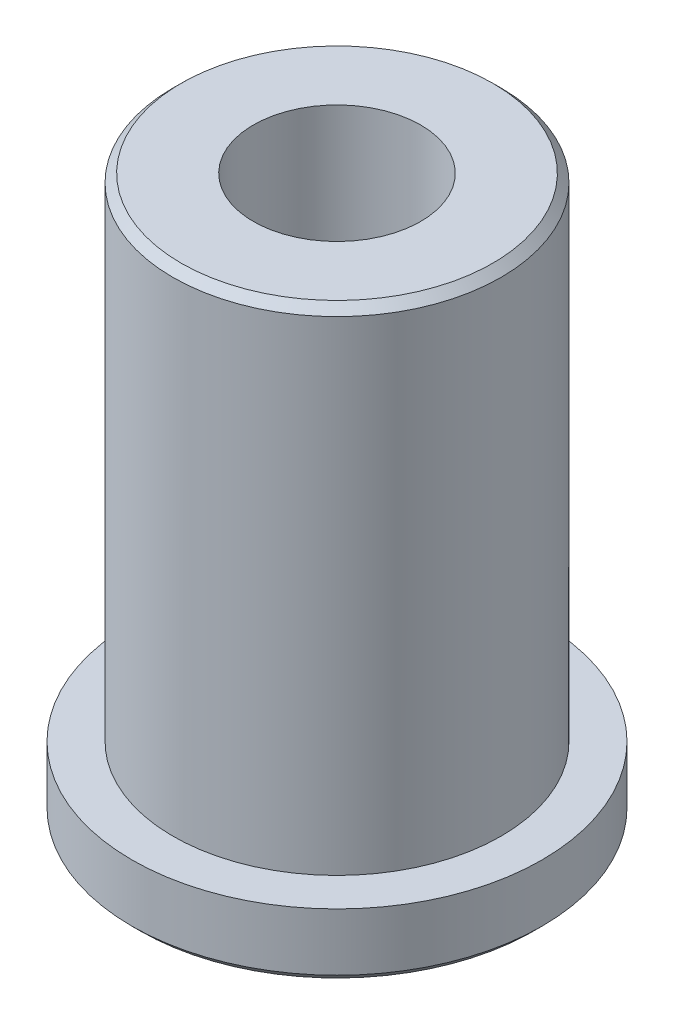
ISO-10303-21;
HEADER;
FILE_DESCRIPTION(('STEP AP214'),'2;1');
FILE_NAME('part.step','',(''),(''),'','','');
FILE_SCHEMA(('AUTOMOTIVE_DESIGN { 1 0 10303 214 1 1 1 1 }'));
ENDSEC;
DATA;
#1=APPLICATION_CONTEXT('core data for automotive mechanical design processes');
#2=APPLICATION_PROTOCOL_DEFINITION('international standard','automotive_design',2000,#1);
#3=PRODUCT_CONTEXT('',#1,'mechanical');
#4=PRODUCT('Part','Part','',(#3));
#5=PRODUCT_RELATED_PRODUCT_CATEGORY('part','',(#4));
#6=PRODUCT_DEFINITION_FORMATION('','',#4);
#7=PRODUCT_DEFINITION_CONTEXT('part definition',#1,'design');
#8=PRODUCT_DEFINITION('design','',#6,#7);
#9=PRODUCT_DEFINITION_SHAPE('','',#8);
#10=(LENGTH_UNIT() NAMED_UNIT(*) SI_UNIT(.MILLI.,.METRE.));
#11=(NAMED_UNIT(*) PLANE_ANGLE_UNIT() SI_UNIT($,.RADIAN.));
#12=(NAMED_UNIT(*) SI_UNIT($,.STERADIAN.) SOLID_ANGLE_UNIT());
#13=UNCERTAINTY_MEASURE_WITH_UNIT(LENGTH_MEASURE(1.E-05),#10,'distance_accuracy_value','');
#14=(GEOMETRIC_REPRESENTATION_CONTEXT(3) GLOBAL_UNCERTAINTY_ASSIGNED_CONTEXT((#13)) GLOBAL_UNIT_ASSIGNED_CONTEXT((#10,
#11,#12)) REPRESENTATION_CONTEXT('',''));
#15=CARTESIAN_POINT('',(0.,0.,0.));
#16=DIRECTION('',(0.,0.,1.));
#17=DIRECTION('',(1.,0.,0.));
#18=AXIS2_PLACEMENT_3D('',#15,#16,#17);
#19=CARTESIAN_POINT('',(0.,5.6843418860808E-11,0.));
#20=DIRECTION('',(0.,-1.,0.));
#21=DIRECTION('',(0.,0.,-1.));
#22=AXIS2_PLACEMENT_3D('',#19,#20,#21);
#23=CONICAL_SURFACE('',#22,6.50000000001683,0.785398163397448);
#24=CARTESIAN_POINT('',(0.,1.4,0.));
#25=DIRECTION('',(0.,-1.,0.));
#26=DIRECTION('',(0.,0.,-1.));
#27=AXIS2_PLACEMENT_3D('',#24,#25,#26);
#28=CIRCLE('',#27,5.1);
#29=CARTESIAN_POINT('',(0.,1.4,-5.1));
#30=VERTEX_POINT('',#29);
#31=EDGE_CURVE('E30',#30,#30,#28,.F.);
#32=ORIENTED_EDGE('',*,*,#31,.T.);
#33=EDGE_LOOP('',(#32));
#34=FACE_BOUND('',#33,.T.);
#35=CARTESIAN_POINT('',(0.,5.6843418860808E-11,0.));
#36=DIRECTION('',(0.,-1.,0.));
#37=DIRECTION('',(0.,0.,-1.));
#38=AXIS2_PLACEMENT_3D('',#35,#36,#37);
#39=CIRCLE('',#38,6.50000000001683);
#40=CARTESIAN_POINT('',(0.,5.6843418860808E-11,-6.50000000001683));
#41=VERTEX_POINT('',#40);
#42=EDGE_CURVE('E17',#41,#41,#39,.T.);
#43=ORIENTED_EDGE('',*,*,#42,.T.);
#44=EDGE_LOOP('',(#43));
#45=FACE_BOUND('',#44,.T.);
#46=ADVANCED_FACE('F14',(#34,#45),#23,.F.);
#47=CARTESIAN_POINT('',(-12.5,0.,0.));
#48=DIRECTION('',(0.,1.,0.));
#49=DIRECTION('',(-1.,0.,0.));
#50=AXIS2_PLACEMENT_3D('',#47,#48,#49);
#51=PLANE('',#50);
#52=CARTESIAN_POINT('',(0.,0.,0.));
#53=DIRECTION('',(0.,1.,0.));
#54=DIRECTION('',(0.,0.,1.));
#55=AXIS2_PLACEMENT_3D('',#52,#53,#54);
#56=CIRCLE('',#55,12.);
#57=CARTESIAN_POINT('',(0.,0.,12.));
#58=VERTEX_POINT('',#57);
#59=EDGE_CURVE('E40',#58,#58,#56,.T.);
#60=ORIENTED_EDGE('',*,*,#59,.F.);
#61=EDGE_LOOP('',(#60));
#62=FACE_BOUND('',#61,.T.);
#63=ORIENTED_EDGE('',*,*,#42,.F.);
#64=EDGE_LOOP('',(#63));
#65=FACE_BOUND('',#64,.T.);
#66=ADVANCED_FACE('F51',(#62,#65),#51,.F.);
#67=CARTESIAN_POINT('',(0.,0.,0.));
#68=DIRECTION('',(0.,-1.,0.));
#69=DIRECTION('',(0.,0.,-1.));
#70=AXIS2_PLACEMENT_3D('',#67,#68,#69);
#71=CYLINDRICAL_SURFACE('',#70,5.1);
#72=CARTESIAN_POINT('',(0.,34.,0.));
#73=DIRECTION('',(0.,-1.,0.));
#74=DIRECTION('',(0.,0.,-1.));
#75=AXIS2_PLACEMENT_3D('',#72,#73,#74);
#76=CIRCLE('',#75,5.1);
#77=CARTESIAN_POINT('',(0.,34.,-5.1));
#78=VERTEX_POINT('',#77);
#79=EDGE_CURVE('E38',#78,#78,#76,.F.);
#80=ORIENTED_EDGE('',*,*,#79,.T.);
#81=EDGE_LOOP('',(#80));
#82=FACE_BOUND('',#81,.T.);
#83=ORIENTED_EDGE('',*,*,#31,.F.);
#84=EDGE_LOOP('',(#83));
#85=FACE_BOUND('',#84,.T.);
#86=ADVANCED_FACE('F53',(#82,#85),#71,.F.);
#87=CARTESIAN_POINT('',(0.,0.499999999999999,0.));
#88=DIRECTION('',(0.,1.,0.));
#89=DIRECTION('',(0.,0.,1.));
#90=AXIS2_PLACEMENT_3D('',#87,#88,#89);
#91=CONICAL_SURFACE('',#90,12.5,0.785398163397453);
#92=CARTESIAN_POINT('',(0.,0.499999999999999,0.));
#93=DIRECTION('',(0.,-1.,0.));
#94=DIRECTION('',(1.,0.,0.));
#95=AXIS2_PLACEMENT_3D('',#92,#93,#94);
#96=CIRCLE('',#95,12.5);
#97=CARTESIAN_POINT('',(12.5,0.499999999999999,0.));
#98=VERTEX_POINT('',#97);
#99=EDGE_CURVE('E37',#98,#98,#96,.F.);
#100=ORIENTED_EDGE('',*,*,#99,.F.);
#101=EDGE_LOOP('',(#100));
#102=FACE_BOUND('',#101,.T.);
#103=ORIENTED_EDGE('',*,*,#59,.T.);
#104=EDGE_LOOP('',(#103));
#105=FACE_BOUND('',#104,.T.);
#106=ADVANCED_FACE('F60',(#102,#105),#91,.T.);
#107=CARTESIAN_POINT('',(0.,34.,0.));
#108=DIRECTION('',(0.,-1.,0.));
#109=DIRECTION('',(1.,0.,0.));
#110=AXIS2_PLACEMENT_3D('',#107,#108,#109);
#111=PLANE('',#110);
#112=CARTESIAN_POINT('',(0.,34.,0.));
#113=DIRECTION('',(0.,-1.,0.));
#114=DIRECTION('',(0.,0.,-1.));
#115=AXIS2_PLACEMENT_3D('',#112,#113,#114);
#116=CIRCLE('',#115,9.50000000000001);
#117=CARTESIAN_POINT('',(0.,34.,-9.50000000000001));
#118=VERTEX_POINT('',#117);
#119=EDGE_CURVE('E34',#118,#118,#116,.T.);
#120=ORIENTED_EDGE('',*,*,#119,.F.);
#121=EDGE_LOOP('',(#120));
#122=FACE_BOUND('',#121,.T.);
#123=ORIENTED_EDGE('',*,*,#79,.F.);
#124=EDGE_LOOP('',(#123));
#125=FACE_BOUND('',#124,.T.);
#126=ADVANCED_FACE('F82',(#122,#125),#111,.F.);
#127=CARTESIAN_POINT('',(0.,0.,0.));
#128=DIRECTION('',(0.,-1.,0.));
#129=DIRECTION('',(1.,0.,0.));
#130=AXIS2_PLACEMENT_3D('',#127,#128,#129);
#131=CYLINDRICAL_SURFACE('',#130,12.5);
#132=ORIENTED_EDGE('',*,*,#99,.T.);
#133=EDGE_LOOP('',(#132));
#134=FACE_BOUND('',#133,.T.);
#135=CARTESIAN_POINT('',(0.,4.,0.));
#136=DIRECTION('',(0.,-1.,0.));
#137=DIRECTION('',(1.,0.,0.));
#138=AXIS2_PLACEMENT_3D('',#135,#136,#137);
#139=CIRCLE('',#138,12.5);
#140=CARTESIAN_POINT('',(12.5,4.,0.));
#141=VERTEX_POINT('',#140);
#142=EDGE_CURVE('E26',#141,#141,#139,.T.);
#143=ORIENTED_EDGE('',*,*,#142,.T.);
#144=EDGE_LOOP('',(#143));
#145=FACE_BOUND('',#144,.T.);
#146=ADVANCED_FACE('F78',(#134,#145),#131,.T.);
#147=CARTESIAN_POINT('',(0.,33.5,0.));
#148=DIRECTION('',(0.,-1.,0.));
#149=DIRECTION('',(0.,0.,-1.));
#150=AXIS2_PLACEMENT_3D('',#147,#148,#149);
#151=CONICAL_SURFACE('',#150,10.,0.78539816339744);
#152=CARTESIAN_POINT('',(0.,33.5,0.));
#153=DIRECTION('',(0.,-1.,0.));
#154=DIRECTION('',(1.,0.,0.));
#155=AXIS2_PLACEMENT_3D('',#152,#153,#154);
#156=CIRCLE('',#155,10.);
#157=CARTESIAN_POINT('',(10.,33.5,0.));
#158=VERTEX_POINT('',#157);
#159=EDGE_CURVE('E21',#158,#158,#156,.T.);
#160=ORIENTED_EDGE('',*,*,#159,.F.);
#161=EDGE_LOOP('',(#160));
#162=FACE_BOUND('',#161,.T.);
#163=ORIENTED_EDGE('',*,*,#119,.T.);
#164=EDGE_LOOP('',(#163));
#165=FACE_BOUND('',#164,.T.);
#166=ADVANCED_FACE('F71',(#162,#165),#151,.T.);
#167=CARTESIAN_POINT('',(-10.,4.,0.));
#168=DIRECTION('',(0.,-1.,0.));
#169=DIRECTION('',(1.,0.,0.));
#170=AXIS2_PLACEMENT_3D('',#167,#168,#169);
#171=PLANE('',#170);
#172=CARTESIAN_POINT('',(0.,4.,0.));
#173=DIRECTION('',(0.,-1.,0.));
#174=DIRECTION('',(1.,0.,0.));
#175=AXIS2_PLACEMENT_3D('',#172,#173,#174);
#176=CIRCLE('',#175,10.);
#177=CARTESIAN_POINT('',(10.,4.,0.));
#178=VERTEX_POINT('',#177);
#179=EDGE_CURVE('E10',#178,#178,#176,.F.);
#180=ORIENTED_EDGE('',*,*,#179,.F.);
#181=EDGE_LOOP('',(#180));
#182=FACE_BOUND('',#181,.T.);
#183=ORIENTED_EDGE('',*,*,#142,.F.);
#184=EDGE_LOOP('',(#183));
#185=FACE_BOUND('',#184,.T.);
#186=ADVANCED_FACE('F66',(#182,#185),#171,.F.);
#187=CARTESIAN_POINT('',(0.,0.,0.));
#188=DIRECTION('',(0.,-1.,0.));
#189=DIRECTION('',(1.,0.,0.));
#190=AXIS2_PLACEMENT_3D('',#187,#188,#189);
#191=CYLINDRICAL_SURFACE('',#190,10.);
#192=ORIENTED_EDGE('',*,*,#179,.T.);
#193=EDGE_LOOP('',(#192));
#194=FACE_BOUND('',#193,.T.);
#195=ORIENTED_EDGE('',*,*,#159,.T.);
#196=EDGE_LOOP('',(#195));
#197=FACE_BOUND('',#196,.T.);
#198=ADVANCED_FACE('F64',(#194,#197),#191,.T.);
#199=CLOSED_SHELL('',(#46,#66,#86,#106,#126,#146,#166,#186,#198));
#200=MANIFOLD_SOLID_BREP('B1',#199);
#201=ADVANCED_BREP_SHAPE_REPRESENTATION('',(#18,#200),#14);
#202=SHAPE_DEFINITION_REPRESENTATION(#9,#201);
ENDSEC;
END-ISO-10303-21;
